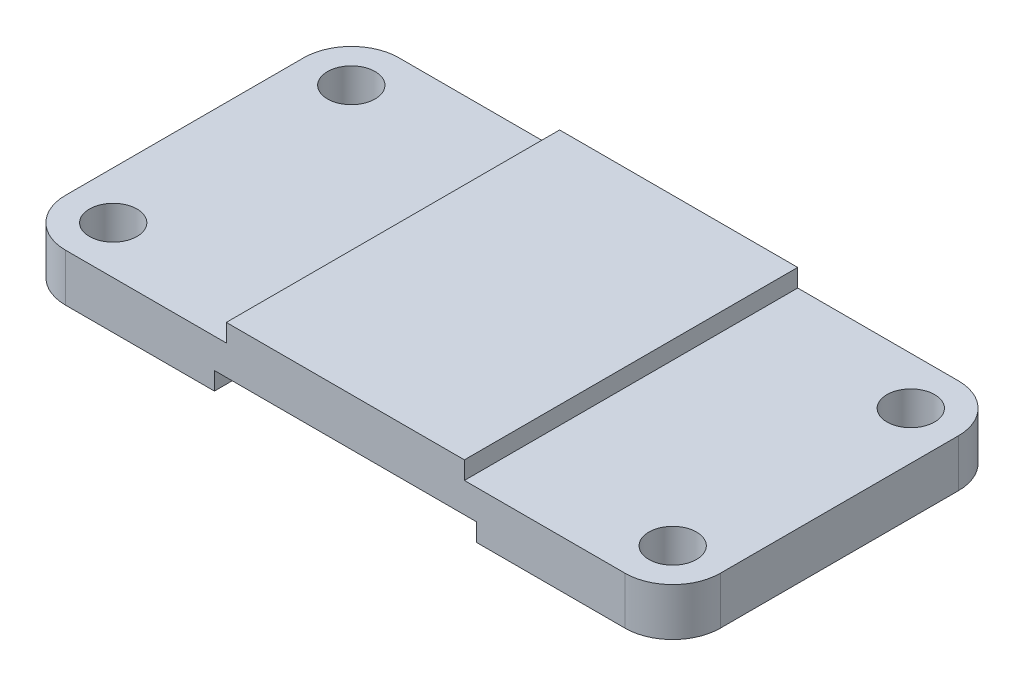
ISO-10303-21;
HEADER;
FILE_DESCRIPTION(('STEP AP214'),'2;1');
FILE_NAME('part.step','',(''),(''),'','','');
FILE_SCHEMA(('AUTOMOTIVE_DESIGN { 1 0 10303 214 1 1 1 1 }'));
ENDSEC;
DATA;
#1=APPLICATION_CONTEXT('core data for automotive mechanical design processes');
#2=APPLICATION_PROTOCOL_DEFINITION('international standard','automotive_design',2000,#1);
#3=PRODUCT_CONTEXT('',#1,'mechanical');
#4=PRODUCT('Part','Part','',(#3));
#5=PRODUCT_RELATED_PRODUCT_CATEGORY('part','',(#4));
#6=PRODUCT_DEFINITION_FORMATION('','',#4);
#7=PRODUCT_DEFINITION_CONTEXT('part definition',#1,'design');
#8=PRODUCT_DEFINITION('design','',#6,#7);
#9=PRODUCT_DEFINITION_SHAPE('','',#8);
#10=(LENGTH_UNIT() NAMED_UNIT(*) SI_UNIT(.MILLI.,.METRE.));
#11=(NAMED_UNIT(*) PLANE_ANGLE_UNIT() SI_UNIT($,.RADIAN.));
#12=(NAMED_UNIT(*) SI_UNIT($,.STERADIAN.) SOLID_ANGLE_UNIT());
#13=UNCERTAINTY_MEASURE_WITH_UNIT(LENGTH_MEASURE(1.E-05),#10,'distance_accuracy_value','');
#14=(GEOMETRIC_REPRESENTATION_CONTEXT(3) GLOBAL_UNCERTAINTY_ASSIGNED_CONTEXT((#13)) GLOBAL_UNIT_ASSIGNED_CONTEXT((#10,
#11,#12)) REPRESENTATION_CONTEXT('',''));
#15=CARTESIAN_POINT('',(0.,0.,0.));
#16=DIRECTION('',(0.,0.,1.));
#17=DIRECTION('',(1.,0.,0.));
#18=AXIS2_PLACEMENT_3D('',#15,#16,#17);
#19=CARTESIAN_POINT('',(-470.,80.,-200.));
#20=DIRECTION('',(0.,-1.,0.));
#21=DIRECTION('',(0.,0.,-1.));
#22=AXIS2_PLACEMENT_3D('',#19,#20,#21);
#23=PLANE('',#22);
#24=CARTESIAN_POINT('',(-470.,80.,-200.));
#25=DIRECTION('',(0.,1.,0.));
#26=DIRECTION('',(0.,0.,1.));
#27=AXIS2_PLACEMENT_3D('',#24,#25,#26);
#28=CIRCLE('',#27,40.);
#29=CARTESIAN_POINT('',(-470.,80.,-160.));
#30=VERTEX_POINT('',#29);
#31=EDGE_CURVE('E226',#30,#30,#28,.T.);
#32=ORIENTED_EDGE('',*,*,#31,.F.);
#33=EDGE_LOOP('',(#32));
#34=FACE_BOUND('',#33,.T.);
#35=CARTESIAN_POINT('',(-470.,80.,200.));
#36=DIRECTION('',(0.,1.,0.));
#37=DIRECTION('',(0.,0.,1.));
#38=AXIS2_PLACEMENT_3D('',#35,#36,#37);
#39=CIRCLE('',#38,40.);
#40=CARTESIAN_POINT('',(-470.,80.,240.));
#41=VERTEX_POINT('',#40);
#42=EDGE_CURVE('E220',#41,#41,#39,.T.);
#43=ORIENTED_EDGE('',*,*,#42,.F.);
#44=EDGE_LOOP('',(#43));
#45=FACE_BOUND('',#44,.T.);
#46=DIRECTION('',(0.,0.,1.));
#47=VECTOR('',#46,1.);
#48=CARTESIAN_POINT('',(-200.,80.000000000003,-280.));
#49=LINE('',#48,#47);
#50=CARTESIAN_POINT('',(-200.,80.000000000003,-280.));
#51=VERTEX_POINT('',#50);
#52=CARTESIAN_POINT('',(-200.,80.000000000003,280.));
#53=VERTEX_POINT('',#52);
#54=EDGE_CURVE('E181',#51,#53,#49,.T.);
#55=ORIENTED_EDGE('',*,*,#54,.F.);
#56=DIRECTION('',(-1.,0.,0.));
#57=VECTOR('',#56,1.);
#58=CARTESIAN_POINT('',(-470.,80.,-280.));
#59=LINE('',#58,#57);
#60=CARTESIAN_POINT('',(-470.,80.,-280.));
#61=VERTEX_POINT('',#60);
#62=EDGE_CURVE('E250',#51,#61,#59,.T.);
#63=ORIENTED_EDGE('',*,*,#62,.T.);
#64=CARTESIAN_POINT('',(-470.,80.,-200.));
#65=DIRECTION('',(0.,1.,0.));
#66=DIRECTION('',(0.,0.,-1.));
#67=AXIS2_PLACEMENT_3D('',#64,#65,#66);
#68=CIRCLE('',#67,80.);
#69=CARTESIAN_POINT('',(-550.,80.,-200.));
#70=VERTEX_POINT('',#69);
#71=EDGE_CURVE('E232',#61,#70,#68,.T.);
#72=ORIENTED_EDGE('',*,*,#71,.T.);
#73=DIRECTION('',(0.,0.,1.));
#74=VECTOR('',#73,1.);
#75=CARTESIAN_POINT('',(-550.,80.,199.999999999999));
#76=LINE('',#75,#74);
#77=CARTESIAN_POINT('',(-550.,80.,199.999999999999));
#78=VERTEX_POINT('',#77);
#79=EDGE_CURVE('E235',#70,#78,#76,.T.);
#80=ORIENTED_EDGE('',*,*,#79,.T.);
#81=CARTESIAN_POINT('',(-470.,80.,200.));
#82=DIRECTION('',(0.,1.,0.));
#83=DIRECTION('',(0.,0.,-1.));
#84=AXIS2_PLACEMENT_3D('',#81,#82,#83);
#85=CIRCLE('',#84,80.);
#86=CARTESIAN_POINT('',(-470.,80.,280.));
#87=VERTEX_POINT('',#86);
#88=EDGE_CURVE('E238',#78,#87,#85,.T.);
#89=ORIENTED_EDGE('',*,*,#88,.T.);
#90=DIRECTION('',(1.,0.,0.));
#91=VECTOR('',#90,1.);
#92=CARTESIAN_POINT('',(-470.,80.,280.));
#93=LINE('',#92,#91);
#94=EDGE_CURVE('E241',#87,#53,#93,.T.);
#95=ORIENTED_EDGE('',*,*,#94,.T.);
#96=EDGE_LOOP('',(#55,#63,#72,#80,#89,#95));
#97=FACE_BOUND('',#96,.T.);
#98=ADVANCED_FACE('F36',(#34,#45,#97),#23,.F.);
#99=CARTESIAN_POINT('',(-470.,0.,-200.));
#100=DIRECTION('',(0.,-1.,0.));
#101=DIRECTION('',(0.,0.,-1.));
#102=AXIS2_PLACEMENT_3D('',#99,#100,#101);
#103=PLANE('',#102);
#104=DIRECTION('',(0.,0.,1.));
#105=VECTOR('',#104,1.);
#106=CARTESIAN_POINT('',(220.,0.,-280.));
#107=LINE('',#106,#105);
#108=CARTESIAN_POINT('',(220.,0.,-280.));
#109=VERTEX_POINT('',#108);
#110=CARTESIAN_POINT('',(220.,0.,280.));
#111=VERTEX_POINT('',#110);
#112=EDGE_CURVE('E199',#109,#111,#107,.T.);
#113=ORIENTED_EDGE('',*,*,#112,.F.);
#114=DIRECTION('',(-1.,0.,0.));
#115=VECTOR('',#114,1.);
#116=CARTESIAN_POINT('',(-470.,0.,-280.));
#117=LINE('',#116,#115);
#118=CARTESIAN_POINT('',(469.999999999999,0.,-280.));
#119=VERTEX_POINT('',#118);
#120=EDGE_CURVE('E236',#119,#109,#117,.T.);
#121=ORIENTED_EDGE('',*,*,#120,.F.);
#122=CARTESIAN_POINT('',(470.,0.,-200.));
#123=DIRECTION('',(0.,1.,0.));
#124=DIRECTION('',(0.,0.,-1.));
#125=AXIS2_PLACEMENT_3D('',#122,#123,#124);
#126=CIRCLE('',#125,80.);
#127=CARTESIAN_POINT('',(550.,0.,-200.));
#128=VERTEX_POINT('',#127);
#129=EDGE_CURVE('E268',#128,#119,#126,.T.);
#130=ORIENTED_EDGE('',*,*,#129,.F.);
#131=DIRECTION('',(0.,0.,-1.));
#132=VECTOR('',#131,1.);
#133=CARTESIAN_POINT('',(550.,0.,199.999999999999));
#134=LINE('',#133,#132);
#135=CARTESIAN_POINT('',(550.,0.,199.999999999999));
#136=VERTEX_POINT('',#135);
#137=EDGE_CURVE('E266',#136,#128,#134,.T.);
#138=ORIENTED_EDGE('',*,*,#137,.F.);
#139=CARTESIAN_POINT('',(470.,0.,200.));
#140=DIRECTION('',(0.,1.,0.));
#141=DIRECTION('',(0.,0.,1.));
#142=AXIS2_PLACEMENT_3D('',#139,#140,#141);
#143=CIRCLE('',#142,80.);
#144=CARTESIAN_POINT('',(469.999999999999,0.,280.));
#145=VERTEX_POINT('',#144);
#146=EDGE_CURVE('E264',#145,#136,#143,.T.);
#147=ORIENTED_EDGE('',*,*,#146,.F.);
#148=DIRECTION('',(1.,0.,0.));
#149=VECTOR('',#148,1.);
#150=CARTESIAN_POINT('',(-470.,0.,280.));
#151=LINE('',#150,#149);
#152=EDGE_CURVE('E260',#111,#145,#151,.T.);
#153=ORIENTED_EDGE('',*,*,#152,.F.);
#154=EDGE_LOOP('',(#113,#121,#130,#138,#147,#153));
#155=FACE_BOUND('',#154,.T.);
#156=CARTESIAN_POINT('',(470.,0.,-200.));
#157=DIRECTION('',(0.,1.,0.));
#158=DIRECTION('',(0.,0.,1.));
#159=AXIS2_PLACEMENT_3D('',#156,#157,#158);
#160=CIRCLE('',#159,40.);
#161=CARTESIAN_POINT('',(470.,0.,-160.));
#162=VERTEX_POINT('',#161);
#163=EDGE_CURVE('E201',#162,#162,#160,.T.);
#164=ORIENTED_EDGE('',*,*,#163,.T.);
#165=EDGE_LOOP('',(#164));
#166=FACE_BOUND('',#165,.T.);
#167=CARTESIAN_POINT('',(470.,0.,200.));
#168=DIRECTION('',(0.,1.,0.));
#169=DIRECTION('',(0.,0.,1.));
#170=AXIS2_PLACEMENT_3D('',#167,#168,#169);
#171=CIRCLE('',#170,40.);
#172=CARTESIAN_POINT('',(470.,0.,240.));
#173=VERTEX_POINT('',#172);
#174=EDGE_CURVE('E211',#173,#173,#171,.T.);
#175=ORIENTED_EDGE('',*,*,#174,.T.);
#176=EDGE_LOOP('',(#175));
#177=FACE_BOUND('',#176,.T.);
#178=ADVANCED_FACE('F332',(#155,#166,#177),#103,.T.);
#179=CARTESIAN_POINT('',(469.999999999999,80.,-280.));
#180=VERTEX_POINT('',#179);
#181=CARTESIAN_POINT('',(200.,80.,-280.));
#182=VERTEX_POINT('',#181);
#183=EDGE_CURVE('E251',#180,#182,#59,.T.);
#184=ORIENTED_EDGE('',*,*,#183,.T.);
#185=DIRECTION('',(0.,0.,1.));
#186=VECTOR('',#185,1.);
#187=CARTESIAN_POINT('',(200.,80.,-280.));
#188=LINE('',#187,#186);
#189=CARTESIAN_POINT('',(200.,80.,280.));
#190=VERTEX_POINT('',#189);
#191=EDGE_CURVE('E170',#182,#190,#188,.T.);
#192=ORIENTED_EDGE('',*,*,#191,.T.);
#193=CARTESIAN_POINT('',(469.999999999999,80.,280.));
#194=VERTEX_POINT('',#193);
#195=EDGE_CURVE('E240',#190,#194,#93,.T.);
#196=ORIENTED_EDGE('',*,*,#195,.T.);
#197=CARTESIAN_POINT('',(470.,80.,200.));
#198=DIRECTION('',(0.,1.,0.));
#199=DIRECTION('',(0.,0.,1.));
#200=AXIS2_PLACEMENT_3D('',#197,#198,#199);
#201=CIRCLE('',#200,80.);
#202=CARTESIAN_POINT('',(550.,80.,199.999999999999));
#203=VERTEX_POINT('',#202);
#204=EDGE_CURVE('E244',#194,#203,#201,.T.);
#205=ORIENTED_EDGE('',*,*,#204,.T.);
#206=DIRECTION('',(0.,0.,-1.));
#207=VECTOR('',#206,1.);
#208=CARTESIAN_POINT('',(550.,80.,199.999999999999));
#209=LINE('',#208,#207);
#210=CARTESIAN_POINT('',(550.,80.,-200.));
#211=VERTEX_POINT('',#210);
#212=EDGE_CURVE('E246',#203,#211,#209,.T.);
#213=ORIENTED_EDGE('',*,*,#212,.T.);
#214=CARTESIAN_POINT('',(470.,80.,-200.));
#215=DIRECTION('',(0.,1.,0.));
#216=DIRECTION('',(0.,0.,-1.));
#217=AXIS2_PLACEMENT_3D('',#214,#215,#216);
#218=CIRCLE('',#217,80.);
#219=EDGE_CURVE('E248',#211,#180,#218,.T.);
#220=ORIENTED_EDGE('',*,*,#219,.T.);
#221=EDGE_LOOP('',(#184,#192,#196,#205,#213,#220));
#222=FACE_BOUND('',#221,.T.);
#223=CARTESIAN_POINT('',(470.,80.,200.));
#224=DIRECTION('',(0.,1.,0.));
#225=DIRECTION('',(0.,0.,1.));
#226=AXIS2_PLACEMENT_3D('',#223,#224,#225);
#227=CIRCLE('',#226,40.);
#228=CARTESIAN_POINT('',(470.,80.,240.));
#229=VERTEX_POINT('',#228);
#230=EDGE_CURVE('E214',#229,#229,#227,.T.);
#231=ORIENTED_EDGE('',*,*,#230,.F.);
#232=EDGE_LOOP('',(#231));
#233=FACE_BOUND('',#232,.T.);
#234=CARTESIAN_POINT('',(470.,80.,-200.));
#235=DIRECTION('',(0.,1.,0.));
#236=DIRECTION('',(0.,0.,1.));
#237=AXIS2_PLACEMENT_3D('',#234,#235,#236);
#238=CIRCLE('',#237,40.);
#239=CARTESIAN_POINT('',(470.,80.,-160.));
#240=VERTEX_POINT('',#239);
#241=EDGE_CURVE('E208',#240,#240,#238,.T.);
#242=ORIENTED_EDGE('',*,*,#241,.F.);
#243=EDGE_LOOP('',(#242));
#244=FACE_BOUND('',#243,.T.);
#245=ADVANCED_FACE('F335',(#222,#233,#244),#23,.F.);
#246=DIRECTION('',(0.,0.,1.));
#247=VECTOR('',#246,1.);
#248=CARTESIAN_POINT('',(-220.,0.,-280.));
#249=LINE('',#248,#247);
#250=CARTESIAN_POINT('',(-220.,0.,-280.));
#251=VERTEX_POINT('',#250);
#252=CARTESIAN_POINT('',(-220.,0.,280.));
#253=VERTEX_POINT('',#252);
#254=EDGE_CURVE('E202',#251,#253,#249,.T.);
#255=ORIENTED_EDGE('',*,*,#254,.T.);
#256=CARTESIAN_POINT('',(-470.,0.,280.));
#257=VERTEX_POINT('',#256);
#258=EDGE_CURVE('E261',#257,#253,#151,.T.);
#259=ORIENTED_EDGE('',*,*,#258,.F.);
#260=CARTESIAN_POINT('',(-470.,0.,200.));
#261=DIRECTION('',(0.,1.,0.));
#262=DIRECTION('',(0.,0.,-1.));
#263=AXIS2_PLACEMENT_3D('',#260,#261,#262);
#264=CIRCLE('',#263,80.);
#265=CARTESIAN_POINT('',(-550.,0.,199.999999999999));
#266=VERTEX_POINT('',#265);
#267=EDGE_CURVE('E258',#266,#257,#264,.T.);
#268=ORIENTED_EDGE('',*,*,#267,.F.);
#269=DIRECTION('',(0.,0.,1.));
#270=VECTOR('',#269,1.);
#271=CARTESIAN_POINT('',(-550.,0.,199.999999999999));
#272=LINE('',#271,#270);
#273=CARTESIAN_POINT('',(-550.,0.,-200.));
#274=VERTEX_POINT('',#273);
#275=EDGE_CURVE('E256',#274,#266,#272,.T.);
#276=ORIENTED_EDGE('',*,*,#275,.F.);
#277=CARTESIAN_POINT('',(-470.,0.,-200.));
#278=DIRECTION('',(0.,1.,0.));
#279=DIRECTION('',(0.,0.,-1.));
#280=AXIS2_PLACEMENT_3D('',#277,#278,#279);
#281=CIRCLE('',#280,80.);
#282=CARTESIAN_POINT('',(-470.,0.,-280.));
#283=VERTEX_POINT('',#282);
#284=EDGE_CURVE('E229',#283,#274,#281,.T.);
#285=ORIENTED_EDGE('',*,*,#284,.F.);
#286=EDGE_CURVE('E270',#251,#283,#117,.T.);
#287=ORIENTED_EDGE('',*,*,#286,.F.);
#288=EDGE_LOOP('',(#255,#259,#268,#276,#285,#287));
#289=FACE_BOUND('',#288,.T.);
#290=CARTESIAN_POINT('',(-470.,0.,-200.));
#291=DIRECTION('',(0.,1.,0.));
#292=DIRECTION('',(0.,0.,1.));
#293=AXIS2_PLACEMENT_3D('',#290,#291,#292);
#294=CIRCLE('',#293,40.);
#295=CARTESIAN_POINT('',(-470.,0.,-160.));
#296=VERTEX_POINT('',#295);
#297=EDGE_CURVE('E223',#296,#296,#294,.T.);
#298=ORIENTED_EDGE('',*,*,#297,.T.);
#299=EDGE_LOOP('',(#298));
#300=FACE_BOUND('',#299,.T.);
#301=CARTESIAN_POINT('',(-470.,0.,200.));
#302=DIRECTION('',(0.,1.,0.));
#303=DIRECTION('',(0.,0.,1.));
#304=AXIS2_PLACEMENT_3D('',#301,#302,#303);
#305=CIRCLE('',#304,40.);
#306=CARTESIAN_POINT('',(-470.,0.,240.));
#307=VERTEX_POINT('',#306);
#308=EDGE_CURVE('E217',#307,#307,#305,.T.);
#309=ORIENTED_EDGE('',*,*,#308,.T.);
#310=EDGE_LOOP('',(#309));
#311=FACE_BOUND('',#310,.T.);
#312=ADVANCED_FACE('F298',(#289,#300,#311),#103,.T.);
#313=CARTESIAN_POINT('',(-470.,80.,-200.));
#314=DIRECTION('',(0.,-1.,0.));
#315=DIRECTION('',(0.,0.,-1.));
#316=AXIS2_PLACEMENT_3D('',#313,#314,#315);
#317=CYLINDRICAL_SURFACE('',#316,80.);
#318=ORIENTED_EDGE('',*,*,#284,.T.);
#319=DIRECTION('',(0.,-1.,0.));
#320=VECTOR('',#319,1.);
#321=CARTESIAN_POINT('',(-550.,80.,-200.));
#322=LINE('',#321,#320);
#323=EDGE_CURVE('E11',#70,#274,#322,.T.);
#324=ORIENTED_EDGE('',*,*,#323,.F.);
#325=ORIENTED_EDGE('',*,*,#71,.F.);
#326=DIRECTION('',(0.,-1.,0.));
#327=VECTOR('',#326,1.);
#328=CARTESIAN_POINT('',(-470.,80.,-280.));
#329=LINE('',#328,#327);
#330=EDGE_CURVE('E253',#61,#283,#329,.T.);
#331=ORIENTED_EDGE('',*,*,#330,.T.);
#332=EDGE_LOOP('',(#318,#324,#325,#331));
#333=FACE_BOUND('',#332,.T.);
#334=ADVANCED_FACE('F38',(#333),#317,.T.);
#335=CARTESIAN_POINT('',(-550.,80.,199.999999999999));
#336=DIRECTION('',(1.,0.,0.));
#337=DIRECTION('',(0.,0.,-1.));
#338=AXIS2_PLACEMENT_3D('',#335,#336,#337);
#339=PLANE('',#338);
#340=ORIENTED_EDGE('',*,*,#275,.T.);
#341=DIRECTION('',(0.,-1.,0.));
#342=VECTOR('',#341,1.);
#343=CARTESIAN_POINT('',(-550.,80.,199.999999999999));
#344=LINE('',#343,#342);
#345=EDGE_CURVE('E44',#78,#266,#344,.T.);
#346=ORIENTED_EDGE('',*,*,#345,.F.);
#347=ORIENTED_EDGE('',*,*,#79,.F.);
#348=ORIENTED_EDGE('',*,*,#323,.T.);
#349=EDGE_LOOP('',(#340,#346,#347,#348));
#350=FACE_BOUND('',#349,.T.);
#351=ADVANCED_FACE('F312',(#350),#339,.F.);
#352=CARTESIAN_POINT('',(-470.,80.,200.));
#353=DIRECTION('',(0.,-1.,0.));
#354=DIRECTION('',(0.,0.,-1.));
#355=AXIS2_PLACEMENT_3D('',#352,#353,#354);
#356=CYLINDRICAL_SURFACE('',#355,80.);
#357=ORIENTED_EDGE('',*,*,#267,.T.);
#358=DIRECTION('',(0.,-1.,0.));
#359=VECTOR('',#358,1.);
#360=CARTESIAN_POINT('',(-470.,80.,280.));
#361=LINE('',#360,#359);
#362=EDGE_CURVE('E286',#87,#257,#361,.T.);
#363=ORIENTED_EDGE('',*,*,#362,.F.);
#364=ORIENTED_EDGE('',*,*,#88,.F.);
#365=ORIENTED_EDGE('',*,*,#345,.T.);
#366=EDGE_LOOP('',(#357,#363,#364,#365));
#367=FACE_BOUND('',#366,.T.);
#368=ADVANCED_FACE('F293',(#367),#356,.T.);
#369=CARTESIAN_POINT('',(-470.,80.,280.));
#370=DIRECTION('',(0.,0.,-1.));
#371=DIRECTION('',(-1.,0.,0.));
#372=AXIS2_PLACEMENT_3D('',#369,#370,#371);
#373=PLANE('',#372);
#374=DIRECTION('',(-1.,0.,0.));
#375=VECTOR('',#374,1.);
#376=CARTESIAN_POINT('',(-220.,30.,280.));
#377=LINE('',#376,#375);
#378=CARTESIAN_POINT('',(220.,30.,280.));
#379=VERTEX_POINT('',#378);
#380=CARTESIAN_POINT('',(-220.,30.,280.));
#381=VERTEX_POINT('',#380);
#382=EDGE_CURVE('E195',#379,#381,#377,.T.);
#383=ORIENTED_EDGE('',*,*,#382,.F.);
#384=DIRECTION('',(0.,1.,0.));
#385=VECTOR('',#384,1.);
#386=CARTESIAN_POINT('',(220.,0.,280.));
#387=LINE('',#386,#385);
#388=EDGE_CURVE('E180',#111,#379,#387,.T.);
#389=ORIENTED_EDGE('',*,*,#388,.F.);
#390=ORIENTED_EDGE('',*,*,#152,.T.);
#391=DIRECTION('',(0.,-1.,0.));
#392=VECTOR('',#391,1.);
#393=CARTESIAN_POINT('',(469.999999999999,80.,280.));
#394=LINE('',#393,#392);
#395=EDGE_CURVE('E283',#194,#145,#394,.T.);
#396=ORIENTED_EDGE('',*,*,#395,.F.);
#397=ORIENTED_EDGE('',*,*,#195,.F.);
#398=DIRECTION('',(0.,1.,0.));
#399=VECTOR('',#398,1.);
#400=CARTESIAN_POINT('',(200.,80.,280.));
#401=LINE('',#400,#399);
#402=CARTESIAN_POINT('',(200.,110.,280.));
#403=VERTEX_POINT('',#402);
#404=EDGE_CURVE('E51',#190,#403,#401,.T.);
#405=ORIENTED_EDGE('',*,*,#404,.T.);
#406=DIRECTION('',(-1.,0.,0.));
#407=VECTOR('',#406,1.);
#408=CARTESIAN_POINT('',(-200.,110.000000000003,280.));
#409=LINE('',#408,#407);
#410=CARTESIAN_POINT('',(-200.,110.000000000003,280.));
#411=VERTEX_POINT('',#410);
#412=EDGE_CURVE('E154',#403,#411,#409,.T.);
#413=ORIENTED_EDGE('',*,*,#412,.T.);
#414=DIRECTION('',(0.,-1.,0.));
#415=VECTOR('',#414,1.);
#416=CARTESIAN_POINT('',(-200.,80.000000000003,280.));
#417=LINE('',#416,#415);
#418=EDGE_CURVE('E171',#411,#53,#417,.T.);
#419=ORIENTED_EDGE('',*,*,#418,.T.);
#420=ORIENTED_EDGE('',*,*,#94,.F.);
#421=ORIENTED_EDGE('',*,*,#362,.T.);
#422=ORIENTED_EDGE('',*,*,#258,.T.);
#423=DIRECTION('',(0.,-1.,0.));
#424=VECTOR('',#423,1.);
#425=CARTESIAN_POINT('',(-220.,0.,280.));
#426=LINE('',#425,#424);
#427=EDGE_CURVE('E188',#381,#253,#426,.T.);
#428=ORIENTED_EDGE('',*,*,#427,.F.);
#429=EDGE_LOOP('',(#383,#389,#390,#396,#397,#405,#413,#419,#420,#421,#422,#428));
#430=FACE_BOUND('',#429,.T.);
#431=ADVANCED_FACE('F305',(#430),#373,.F.);
#432=CARTESIAN_POINT('',(470.,80.,200.));
#433=DIRECTION('',(0.,-1.,0.));
#434=DIRECTION('',(0.,0.,-1.));
#435=AXIS2_PLACEMENT_3D('',#432,#433,#434);
#436=CYLINDRICAL_SURFACE('',#435,80.);
#437=ORIENTED_EDGE('',*,*,#146,.T.);
#438=DIRECTION('',(0.,-1.,0.));
#439=VECTOR('',#438,1.);
#440=CARTESIAN_POINT('',(550.,80.,199.999999999999));
#441=LINE('',#440,#439);
#442=EDGE_CURVE('E280',#203,#136,#441,.T.);
#443=ORIENTED_EDGE('',*,*,#442,.F.);
#444=ORIENTED_EDGE('',*,*,#204,.F.);
#445=ORIENTED_EDGE('',*,*,#395,.T.);
#446=EDGE_LOOP('',(#437,#443,#444,#445));
#447=FACE_BOUND('',#446,.T.);
#448=ADVANCED_FACE('F394',(#447),#436,.T.);
#449=CARTESIAN_POINT('',(550.,80.,199.999999999999));
#450=DIRECTION('',(-1.,0.,0.));
#451=DIRECTION('',(0.,0.,1.));
#452=AXIS2_PLACEMENT_3D('',#449,#450,#451);
#453=PLANE('',#452);
#454=ORIENTED_EDGE('',*,*,#137,.T.);
#455=DIRECTION('',(0.,-1.,0.));
#456=VECTOR('',#455,1.);
#457=CARTESIAN_POINT('',(550.,80.,-200.));
#458=LINE('',#457,#456);
#459=EDGE_CURVE('E277',#211,#128,#458,.T.);
#460=ORIENTED_EDGE('',*,*,#459,.F.);
#461=ORIENTED_EDGE('',*,*,#212,.F.);
#462=ORIENTED_EDGE('',*,*,#442,.T.);
#463=EDGE_LOOP('',(#454,#460,#461,#462));
#464=FACE_BOUND('',#463,.T.);
#465=ADVANCED_FACE('F388',(#464),#453,.F.);
#466=CARTESIAN_POINT('',(470.,80.,-200.));
#467=DIRECTION('',(0.,-1.,0.));
#468=DIRECTION('',(0.,0.,-1.));
#469=AXIS2_PLACEMENT_3D('',#466,#467,#468);
#470=CYLINDRICAL_SURFACE('',#469,80.);
#471=ORIENTED_EDGE('',*,*,#129,.T.);
#472=DIRECTION('',(0.,-1.,0.));
#473=VECTOR('',#472,1.);
#474=CARTESIAN_POINT('',(469.999999999999,80.,-280.));
#475=LINE('',#474,#473);
#476=EDGE_CURVE('E274',#180,#119,#475,.T.);
#477=ORIENTED_EDGE('',*,*,#476,.F.);
#478=ORIENTED_EDGE('',*,*,#219,.F.);
#479=ORIENTED_EDGE('',*,*,#459,.T.);
#480=EDGE_LOOP('',(#471,#477,#478,#479));
#481=FACE_BOUND('',#480,.T.);
#482=ADVANCED_FACE('F378',(#481),#470,.T.);
#483=CARTESIAN_POINT('',(-470.,80.,-280.));
#484=DIRECTION('',(0.,0.,1.));
#485=DIRECTION('',(1.,0.,0.));
#486=AXIS2_PLACEMENT_3D('',#483,#484,#485);
#487=PLANE('',#486);
#488=ORIENTED_EDGE('',*,*,#120,.T.);
#489=DIRECTION('',(0.,1.,0.));
#490=VECTOR('',#489,1.);
#491=CARTESIAN_POINT('',(220.,0.,-280.));
#492=LINE('',#491,#490);
#493=CARTESIAN_POINT('',(220.,30.,-280.));
#494=VERTEX_POINT('',#493);
#495=EDGE_CURVE('E184',#109,#494,#492,.T.);
#496=ORIENTED_EDGE('',*,*,#495,.T.);
#497=DIRECTION('',(-1.,0.,0.));
#498=VECTOR('',#497,1.);
#499=CARTESIAN_POINT('',(-220.,30.,-280.));
#500=LINE('',#499,#498);
#501=CARTESIAN_POINT('',(-220.,30.,-280.));
#502=VERTEX_POINT('',#501);
#503=EDGE_CURVE('E187',#494,#502,#500,.T.);
#504=ORIENTED_EDGE('',*,*,#503,.T.);
#505=DIRECTION('',(0.,-1.,0.));
#506=VECTOR('',#505,1.);
#507=CARTESIAN_POINT('',(-220.,0.,-280.));
#508=LINE('',#507,#506);
#509=EDGE_CURVE('E59',#502,#251,#508,.T.);
#510=ORIENTED_EDGE('',*,*,#509,.T.);
#511=ORIENTED_EDGE('',*,*,#286,.T.);
#512=ORIENTED_EDGE('',*,*,#330,.F.);
#513=ORIENTED_EDGE('',*,*,#62,.F.);
#514=DIRECTION('',(0.,-1.,0.));
#515=VECTOR('',#514,1.);
#516=CARTESIAN_POINT('',(-200.,80.000000000003,-280.));
#517=LINE('',#516,#515);
#518=CARTESIAN_POINT('',(-200.,110.000000000003,-280.));
#519=VERTEX_POINT('',#518);
#520=EDGE_CURVE('E157',#519,#51,#517,.T.);
#521=ORIENTED_EDGE('',*,*,#520,.F.);
#522=DIRECTION('',(-1.,0.,0.));
#523=VECTOR('',#522,1.);
#524=CARTESIAN_POINT('',(-200.,110.000000000003,-280.));
#525=LINE('',#524,#523);
#526=CARTESIAN_POINT('',(200.,110.,-280.));
#527=VERTEX_POINT('',#526);
#528=EDGE_CURVE('E152',#527,#519,#525,.T.);
#529=ORIENTED_EDGE('',*,*,#528,.F.);
#530=DIRECTION('',(0.,1.,0.));
#531=VECTOR('',#530,1.);
#532=CARTESIAN_POINT('',(200.,80.,-280.));
#533=LINE('',#532,#531);
#534=EDGE_CURVE('E165',#182,#527,#533,.T.);
#535=ORIENTED_EDGE('',*,*,#534,.F.);
#536=ORIENTED_EDGE('',*,*,#183,.F.);
#537=ORIENTED_EDGE('',*,*,#476,.T.);
#538=EDGE_LOOP('',(#488,#496,#504,#510,#511,#512,#513,#521,#529,#535,#536,#537));
#539=FACE_BOUND('',#538,.T.);
#540=ADVANCED_FACE('F163',(#539),#487,.F.);
#541=CARTESIAN_POINT('',(-470.,80.,-200.));
#542=DIRECTION('',(0.,-1.,0.));
#543=DIRECTION('',(0.,0.,-1.));
#544=AXIS2_PLACEMENT_3D('',#541,#542,#543);
#545=CYLINDRICAL_SURFACE('',#544,40.);
#546=ORIENTED_EDGE('',*,*,#31,.T.);
#547=EDGE_LOOP('',(#546));
#548=FACE_BOUND('',#547,.T.);
#549=ORIENTED_EDGE('',*,*,#297,.F.);
#550=EDGE_LOOP('',(#549));
#551=FACE_BOUND('',#550,.T.);
#552=ADVANCED_FACE('F370',(#548,#551),#545,.F.);
#553=CARTESIAN_POINT('',(-470.,80.,200.));
#554=DIRECTION('',(0.,-1.,0.));
#555=DIRECTION('',(0.,0.,-1.));
#556=AXIS2_PLACEMENT_3D('',#553,#554,#555);
#557=CYLINDRICAL_SURFACE('',#556,40.);
#558=ORIENTED_EDGE('',*,*,#42,.T.);
#559=EDGE_LOOP('',(#558));
#560=FACE_BOUND('',#559,.T.);
#561=ORIENTED_EDGE('',*,*,#308,.F.);
#562=EDGE_LOOP('',(#561));
#563=FACE_BOUND('',#562,.T.);
#564=ADVANCED_FACE('F364',(#560,#563),#557,.F.);
#565=CARTESIAN_POINT('',(470.,80.,200.));
#566=DIRECTION('',(0.,-1.,0.));
#567=DIRECTION('',(0.,0.,-1.));
#568=AXIS2_PLACEMENT_3D('',#565,#566,#567);
#569=CYLINDRICAL_SURFACE('',#568,40.);
#570=ORIENTED_EDGE('',*,*,#230,.T.);
#571=EDGE_LOOP('',(#570));
#572=FACE_BOUND('',#571,.T.);
#573=ORIENTED_EDGE('',*,*,#174,.F.);
#574=EDGE_LOOP('',(#573));
#575=FACE_BOUND('',#574,.T.);
#576=ADVANCED_FACE('F356',(#572,#575),#569,.F.);
#577=CARTESIAN_POINT('',(470.,80.,-200.));
#578=DIRECTION('',(0.,-1.,0.));
#579=DIRECTION('',(0.,0.,-1.));
#580=AXIS2_PLACEMENT_3D('',#577,#578,#579);
#581=CYLINDRICAL_SURFACE('',#580,40.);
#582=ORIENTED_EDGE('',*,*,#241,.T.);
#583=EDGE_LOOP('',(#582));
#584=FACE_BOUND('',#583,.T.);
#585=ORIENTED_EDGE('',*,*,#163,.F.);
#586=EDGE_LOOP('',(#585));
#587=FACE_BOUND('',#586,.T.);
#588=ADVANCED_FACE('F327',(#584,#587),#581,.F.);
#589=CARTESIAN_POINT('',(220.,0.,-280.));
#590=DIRECTION('',(1.,0.,0.));
#591=DIRECTION('',(0.,0.,-1.));
#592=AXIS2_PLACEMENT_3D('',#589,#590,#591);
#593=PLANE('',#592);
#594=ORIENTED_EDGE('',*,*,#388,.T.);
#595=DIRECTION('',(0.,0.,1.));
#596=VECTOR('',#595,1.);
#597=CARTESIAN_POINT('',(220.,30.,-280.));
#598=LINE('',#597,#596);
#599=EDGE_CURVE('E192',#494,#379,#598,.T.);
#600=ORIENTED_EDGE('',*,*,#599,.F.);
#601=ORIENTED_EDGE('',*,*,#495,.F.);
#602=ORIENTED_EDGE('',*,*,#112,.T.);
#603=EDGE_LOOP('',(#594,#600,#601,#602));
#604=FACE_BOUND('',#603,.T.);
#605=ADVANCED_FACE('F320',(#604),#593,.F.);
#606=CARTESIAN_POINT('',(-220.,0.,-280.));
#607=DIRECTION('',(-1.,0.,0.));
#608=DIRECTION('',(0.,0.,1.));
#609=AXIS2_PLACEMENT_3D('',#606,#607,#608);
#610=PLANE('',#609);
#611=ORIENTED_EDGE('',*,*,#427,.T.);
#612=ORIENTED_EDGE('',*,*,#254,.F.);
#613=ORIENTED_EDGE('',*,*,#509,.F.);
#614=DIRECTION('',(0.,0.,1.));
#615=VECTOR('',#614,1.);
#616=CARTESIAN_POINT('',(-220.,30.,-280.));
#617=LINE('',#616,#615);
#618=EDGE_CURVE('E205',#502,#381,#617,.T.);
#619=ORIENTED_EDGE('',*,*,#618,.T.);
#620=EDGE_LOOP('',(#611,#612,#613,#619));
#621=FACE_BOUND('',#620,.T.);
#622=ADVANCED_FACE('F318',(#621),#610,.F.);
#623=CARTESIAN_POINT('',(-220.,30.,-280.));
#624=DIRECTION('',(0.,1.,0.));
#625=DIRECTION('',(0.,0.,1.));
#626=AXIS2_PLACEMENT_3D('',#623,#624,#625);
#627=PLANE('',#626);
#628=ORIENTED_EDGE('',*,*,#382,.T.);
#629=ORIENTED_EDGE('',*,*,#618,.F.);
#630=ORIENTED_EDGE('',*,*,#503,.F.);
#631=ORIENTED_EDGE('',*,*,#599,.T.);
#632=EDGE_LOOP('',(#628,#629,#630,#631));
#633=FACE_BOUND('',#632,.T.);
#634=ADVANCED_FACE('F317',(#633),#627,.F.);
#635=CARTESIAN_POINT('',(200.,80.,-280.));
#636=DIRECTION('',(1.,0.,0.));
#637=DIRECTION('',(0.,0.,-1.));
#638=AXIS2_PLACEMENT_3D('',#635,#636,#637);
#639=PLANE('',#638);
#640=ORIENTED_EDGE('',*,*,#404,.F.);
#641=ORIENTED_EDGE('',*,*,#191,.F.);
#642=ORIENTED_EDGE('',*,*,#534,.T.);
#643=DIRECTION('',(0.,0.,1.));
#644=VECTOR('',#643,1.);
#645=CARTESIAN_POINT('',(200.,110.,-280.));
#646=LINE('',#645,#644);
#647=EDGE_CURVE('E149',#527,#403,#646,.T.);
#648=ORIENTED_EDGE('',*,*,#647,.T.);
#649=EDGE_LOOP('',(#640,#641,#642,#648));
#650=FACE_BOUND('',#649,.T.);
#651=ADVANCED_FACE('F169',(#650),#639,.T.);
#652=CARTESIAN_POINT('',(-200.,80.000000000003,-280.));
#653=DIRECTION('',(-1.,0.,0.));
#654=DIRECTION('',(0.,-1.,0.));
#655=AXIS2_PLACEMENT_3D('',#652,#653,#654);
#656=PLANE('',#655);
#657=ORIENTED_EDGE('',*,*,#418,.F.);
#658=DIRECTION('',(0.,0.,1.));
#659=VECTOR('',#658,1.);
#660=CARTESIAN_POINT('',(-200.,110.000000000003,-280.));
#661=LINE('',#660,#659);
#662=EDGE_CURVE('E156',#519,#411,#661,.T.);
#663=ORIENTED_EDGE('',*,*,#662,.F.);
#664=ORIENTED_EDGE('',*,*,#520,.T.);
#665=ORIENTED_EDGE('',*,*,#54,.T.);
#666=EDGE_LOOP('',(#657,#663,#664,#665));
#667=FACE_BOUND('',#666,.T.);
#668=ADVANCED_FACE('F461',(#667),#656,.T.);
#669=CARTESIAN_POINT('',(-200.,110.000000000003,-280.));
#670=DIRECTION('',(0.,1.,0.));
#671=DIRECTION('',(-1.,0.,0.));
#672=AXIS2_PLACEMENT_3D('',#669,#670,#671);
#673=PLANE('',#672);
#674=ORIENTED_EDGE('',*,*,#412,.F.);
#675=ORIENTED_EDGE('',*,*,#647,.F.);
#676=ORIENTED_EDGE('',*,*,#528,.T.);
#677=ORIENTED_EDGE('',*,*,#662,.T.);
#678=EDGE_LOOP('',(#674,#675,#676,#677));
#679=FACE_BOUND('',#678,.T.);
#680=ADVANCED_FACE('F151',(#679),#673,.T.);
#681=CLOSED_SHELL('',(#98,#178,#245,#312,#334,#351,#368,#431,#448,#465,#482,#540,#552,#564,#576,
#588,#605,#622,#634,#651,#668,#680));
#682=MANIFOLD_SOLID_BREP('B2',#681);
#683=ADVANCED_BREP_SHAPE_REPRESENTATION('',(#18,#682),#14);
#684=SHAPE_DEFINITION_REPRESENTATION(#9,#683);
ENDSEC;
END-ISO-10303-21;
